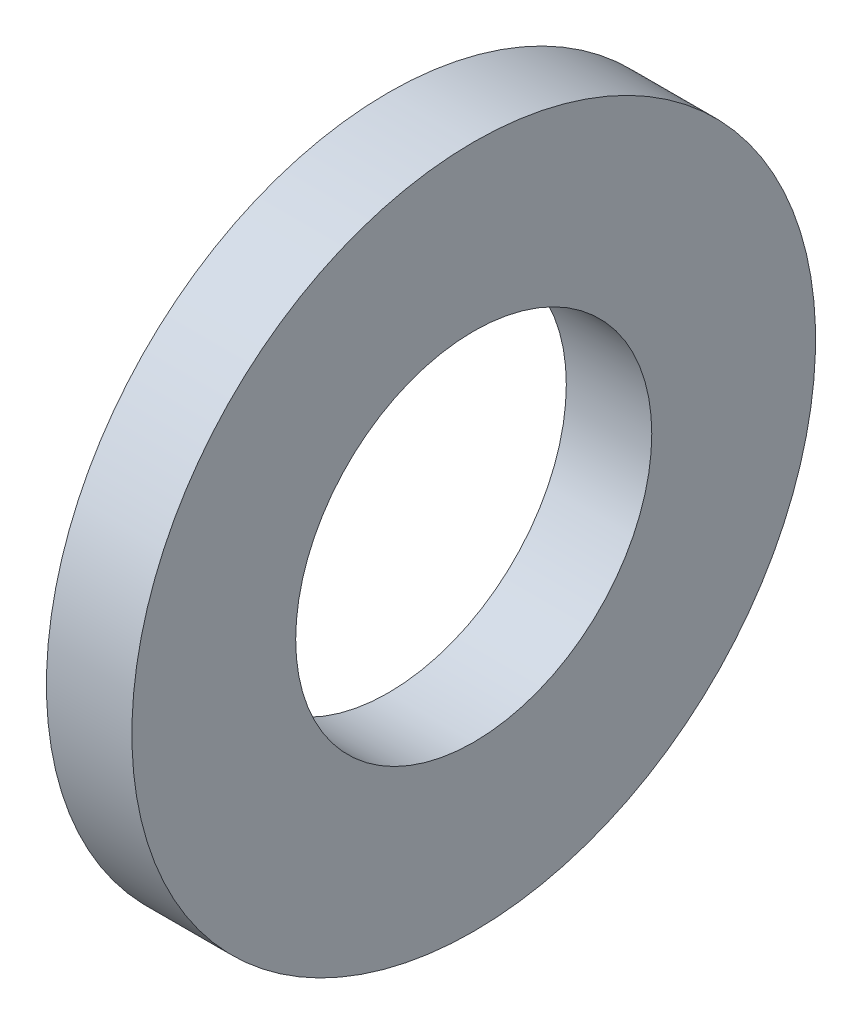
ISO-10303-21;
HEADER;
FILE_DESCRIPTION(('STEP AP214'),'2;1');
FILE_NAME('part.step','',(''),(''),'','','');
FILE_SCHEMA(('AUTOMOTIVE_DESIGN { 1 0 10303 214 1 1 1 1 }'));
ENDSEC;
DATA;
#1=APPLICATION_CONTEXT('core data for automotive mechanical design processes');
#2=APPLICATION_PROTOCOL_DEFINITION('international standard','automotive_design',2000,#1);
#3=PRODUCT_CONTEXT('',#1,'mechanical');
#4=PRODUCT('Part','Part','',(#3));
#5=PRODUCT_RELATED_PRODUCT_CATEGORY('part','',(#4));
#6=PRODUCT_DEFINITION_FORMATION('','',#4);
#7=PRODUCT_DEFINITION_CONTEXT('part definition',#1,'design');
#8=PRODUCT_DEFINITION('design','',#6,#7);
#9=PRODUCT_DEFINITION_SHAPE('','',#8);
#10=(LENGTH_UNIT() NAMED_UNIT(*) SI_UNIT(.MILLI.,.METRE.));
#11=(NAMED_UNIT(*) PLANE_ANGLE_UNIT() SI_UNIT($,.RADIAN.));
#12=(NAMED_UNIT(*) SI_UNIT($,.STERADIAN.) SOLID_ANGLE_UNIT());
#13=UNCERTAINTY_MEASURE_WITH_UNIT(LENGTH_MEASURE(1.E-05),#10,'distance_accuracy_value','');
#14=(GEOMETRIC_REPRESENTATION_CONTEXT(3) GLOBAL_UNCERTAINTY_ASSIGNED_CONTEXT((#13)) GLOBAL_UNIT_ASSIGNED_CONTEXT((#10,
#11,#12)) REPRESENTATION_CONTEXT('',''));
#15=CARTESIAN_POINT('',(0.,0.,0.));
#16=DIRECTION('',(0.,0.,1.));
#17=DIRECTION('',(1.,0.,0.));
#18=AXIS2_PLACEMENT_3D('',#15,#16,#17);
#19=CARTESIAN_POINT('',(484.152262189073,978.585270427388,64.9999999999999));
#20=DIRECTION('',(1.,0.,0.));
#21=DIRECTION('',(0.,-1.,0.));
#22=AXIS2_PLACEMENT_3D('',#19,#20,#21);
#23=PLANE('',#22);
#24=CARTESIAN_POINT('',(484.152262189073,978.585270427388,65.0000000000001));
#25=DIRECTION('',(1.,0.,0.));
#26=DIRECTION('',(0.,-1.,0.));
#27=AXIS2_PLACEMENT_3D('',#24,#25,#26);
#28=CIRCLE('',#27,12.);
#29=CARTESIAN_POINT('',(484.152262189073,990.585270427388,65.));
#30=VERTEX_POINT('',#29);
#31=EDGE_CURVE('E11',#30,#30,#28,.T.);
#32=ORIENTED_EDGE('',*,*,#31,.F.);
#33=EDGE_LOOP('',(#32));
#34=FACE_BOUND('',#33,.T.);
#35=CARTESIAN_POINT('',(484.152262189073,978.585270427388,65.));
#36=DIRECTION('',(-1.,0.,0.));
#37=DIRECTION('',(0.,1.,0.));
#38=AXIS2_PLACEMENT_3D('',#35,#36,#37);
#39=CIRCLE('',#38,6.25);
#40=CARTESIAN_POINT('',(484.152262189073,972.335270427388,65.));
#41=VERTEX_POINT('',#40);
#42=EDGE_CURVE('E67',#41,#41,#39,.T.);
#43=ORIENTED_EDGE('',*,*,#42,.F.);
#44=EDGE_LOOP('',(#43));
#45=FACE_BOUND('',#44,.T.);
#46=ADVANCED_FACE('F42',(#34,#45),#23,.F.);
#47=CARTESIAN_POINT('',(487.152262189073,978.585270427388,64.9999999999999));
#48=DIRECTION('',(1.,0.,0.));
#49=DIRECTION('',(0.,-1.,0.));
#50=AXIS2_PLACEMENT_3D('',#47,#48,#49);
#51=PLANE('',#50);
#52=CARTESIAN_POINT('',(487.152262189073,978.585270427388,65.));
#53=DIRECTION('',(1.,0.,0.));
#54=DIRECTION('',(0.,1.,0.));
#55=AXIS2_PLACEMENT_3D('',#52,#53,#54);
#56=CIRCLE('',#55,12.);
#57=CARTESIAN_POINT('',(487.152262189073,990.585270427388,65.));
#58=VERTEX_POINT('',#57);
#59=EDGE_CURVE('E52',#58,#58,#56,.T.);
#60=ORIENTED_EDGE('',*,*,#59,.T.);
#61=EDGE_LOOP('',(#60));
#62=FACE_BOUND('',#61,.T.);
#63=CARTESIAN_POINT('',(487.152262189073,978.585270427388,65.));
#64=DIRECTION('',(-1.,0.,0.));
#65=DIRECTION('',(0.,1.,0.));
#66=AXIS2_PLACEMENT_3D('',#63,#64,#65);
#67=CIRCLE('',#66,6.25);
#68=CARTESIAN_POINT('',(487.152262189073,972.335270427388,65.));
#69=VERTEX_POINT('',#68);
#70=EDGE_CURVE('E63',#69,#69,#67,.T.);
#71=ORIENTED_EDGE('',*,*,#70,.T.);
#72=EDGE_LOOP('',(#71));
#73=FACE_BOUND('',#72,.T.);
#74=ADVANCED_FACE('F81',(#62,#73),#51,.T.);
#75=CARTESIAN_POINT('',(484.152262189073,978.585270427388,65.0000000000001));
#76=DIRECTION('',(-1.,0.,0.));
#77=DIRECTION('',(0.,-1.,0.));
#78=AXIS2_PLACEMENT_3D('',#75,#76,#77);
#79=CYLINDRICAL_SURFACE('',#78,12.);
#80=ORIENTED_EDGE('',*,*,#31,.T.);
#81=EDGE_LOOP('',(#80));
#82=FACE_BOUND('',#81,.T.);
#83=ORIENTED_EDGE('',*,*,#59,.F.);
#84=EDGE_LOOP('',(#83));
#85=FACE_BOUND('',#84,.T.);
#86=ADVANCED_FACE('F44',(#82,#85),#79,.T.);
#87=CARTESIAN_POINT('',(484.152262189073,978.585270427388,65.));
#88=DIRECTION('',(-1.,0.,0.));
#89=DIRECTION('',(0.,1.,0.));
#90=AXIS2_PLACEMENT_3D('',#87,#88,#89);
#91=CYLINDRICAL_SURFACE('',#90,6.25);
#92=ORIENTED_EDGE('',*,*,#42,.T.);
#93=EDGE_LOOP('',(#92));
#94=FACE_BOUND('',#93,.T.);
#95=ORIENTED_EDGE('',*,*,#70,.F.);
#96=EDGE_LOOP('',(#95));
#97=FACE_BOUND('',#96,.T.);
#98=ADVANCED_FACE('F68',(#94,#97),#91,.F.);
#99=CLOSED_SHELL('',(#46,#74,#86,#98));
#100=MANIFOLD_SOLID_BREP('B2',#99);
#101=ADVANCED_BREP_SHAPE_REPRESENTATION('',(#18,#100),#14);
#102=SHAPE_DEFINITION_REPRESENTATION(#9,#101);
ENDSEC;
END-ISO-10303-21;
